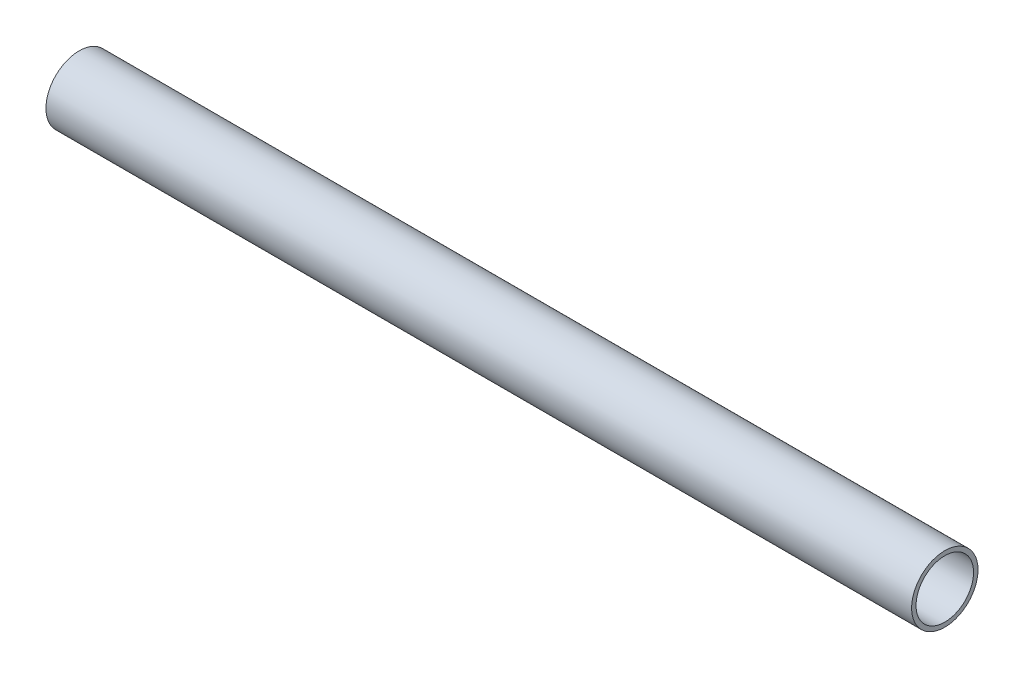
ISO-10303-21;
HEADER;
FILE_DESCRIPTION(('STEP AP214'),'2;1');
FILE_NAME('part.step','',(''),(''),'','','');
FILE_SCHEMA(('AUTOMOTIVE_DESIGN { 1 0 10303 214 1 1 1 1 }'));
ENDSEC;
DATA;
#1=APPLICATION_CONTEXT('core data for automotive mechanical design processes');
#2=APPLICATION_PROTOCOL_DEFINITION('international standard','automotive_design',2000,#1);
#3=PRODUCT_CONTEXT('',#1,'mechanical');
#4=PRODUCT('Part','Part','',(#3));
#5=PRODUCT_RELATED_PRODUCT_CATEGORY('part','',(#4));
#6=PRODUCT_DEFINITION_FORMATION('','',#4);
#7=PRODUCT_DEFINITION_CONTEXT('part definition',#1,'design');
#8=PRODUCT_DEFINITION('design','',#6,#7);
#9=PRODUCT_DEFINITION_SHAPE('','',#8);
#10=(LENGTH_UNIT() NAMED_UNIT(*) SI_UNIT(.MILLI.,.METRE.));
#11=(NAMED_UNIT(*) PLANE_ANGLE_UNIT() SI_UNIT($,.RADIAN.));
#12=(NAMED_UNIT(*) SI_UNIT($,.STERADIAN.) SOLID_ANGLE_UNIT());
#13=UNCERTAINTY_MEASURE_WITH_UNIT(LENGTH_MEASURE(1.E-05),#10,'distance_accuracy_value','');
#14=(GEOMETRIC_REPRESENTATION_CONTEXT(3) GLOBAL_UNCERTAINTY_ASSIGNED_CONTEXT((#13)) GLOBAL_UNIT_ASSIGNED_CONTEXT((#10,
#11,#12)) REPRESENTATION_CONTEXT('',''));
#15=CARTESIAN_POINT('',(0.,0.,0.));
#16=DIRECTION('',(0.,0.,1.));
#17=DIRECTION('',(1.,0.,0.));
#18=AXIS2_PLACEMENT_3D('',#15,#16,#17);
#19=CARTESIAN_POINT('',(195.58,0.,0.));
#20=DIRECTION('',(1.,0.,0.));
#21=DIRECTION('',(0.,0.,-1.));
#22=AXIS2_PLACEMENT_3D('',#19,#20,#21);
#23=PLANE('',#22);
#24=CARTESIAN_POINT('',(195.58,0.,0.));
#25=DIRECTION('',(1.,0.,0.));
#26=DIRECTION('',(0.,0.,-1.));
#27=AXIS2_PLACEMENT_3D('',#24,#25,#26);
#28=CIRCLE('',#27,7.5);
#29=CARTESIAN_POINT('',(195.58,0.,-7.5));
#30=VERTEX_POINT('',#29);
#31=EDGE_CURVE('E12',#30,#30,#28,.T.);
#32=ORIENTED_EDGE('',*,*,#31,.T.);
#33=EDGE_LOOP('',(#32));
#34=FACE_BOUND('',#33,.T.);
#35=CARTESIAN_POINT('',(195.58,0.,0.));
#36=DIRECTION('',(1.,0.,0.));
#37=DIRECTION('',(0.,0.,-1.));
#38=AXIS2_PLACEMENT_3D('',#35,#36,#37);
#39=CIRCLE('',#38,6.5);
#40=CARTESIAN_POINT('',(195.58,0.,-6.5));
#41=VERTEX_POINT('',#40);
#42=EDGE_CURVE('E54',#41,#41,#39,.T.);
#43=ORIENTED_EDGE('',*,*,#42,.F.);
#44=EDGE_LOOP('',(#43));
#45=FACE_BOUND('',#44,.T.);
#46=ADVANCED_FACE('F43',(#34,#45),#23,.T.);
#47=CARTESIAN_POINT('',(0.,0.,0.));
#48=DIRECTION('',(1.,0.,0.));
#49=DIRECTION('',(0.,0.,-1.));
#50=AXIS2_PLACEMENT_3D('',#47,#48,#49);
#51=PLANE('',#50);
#52=CARTESIAN_POINT('',(0.,0.,0.));
#53=DIRECTION('',(1.,0.,0.));
#54=DIRECTION('',(0.,0.,-1.));
#55=AXIS2_PLACEMENT_3D('',#52,#53,#54);
#56=CIRCLE('',#55,7.5);
#57=CARTESIAN_POINT('',(0.,0.,-7.5));
#58=VERTEX_POINT('',#57);
#59=EDGE_CURVE('E47',#58,#58,#56,.T.);
#60=ORIENTED_EDGE('',*,*,#59,.F.);
#61=EDGE_LOOP('',(#60));
#62=FACE_BOUND('',#61,.T.);
#63=CARTESIAN_POINT('',(0.,0.,0.));
#64=DIRECTION('',(1.,0.,0.));
#65=DIRECTION('',(0.,0.,-1.));
#66=AXIS2_PLACEMENT_3D('',#63,#64,#65);
#67=CIRCLE('',#66,6.5);
#68=CARTESIAN_POINT('',(0.,0.,-6.5));
#69=VERTEX_POINT('',#68);
#70=EDGE_CURVE('E56',#69,#69,#67,.T.);
#71=ORIENTED_EDGE('',*,*,#70,.T.);
#72=EDGE_LOOP('',(#71));
#73=FACE_BOUND('',#72,.T.);
#74=ADVANCED_FACE('F66',(#62,#73),#51,.F.);
#75=CARTESIAN_POINT('',(195.58,0.,0.));
#76=DIRECTION('',(-1.,0.,0.));
#77=DIRECTION('',(0.,0.,1.));
#78=AXIS2_PLACEMENT_3D('',#75,#76,#77);
#79=CYLINDRICAL_SURFACE('',#78,7.5);
#80=ORIENTED_EDGE('',*,*,#31,.F.);
#81=EDGE_LOOP('',(#80));
#82=FACE_BOUND('',#81,.T.);
#83=ORIENTED_EDGE('',*,*,#59,.T.);
#84=EDGE_LOOP('',(#83));
#85=FACE_BOUND('',#84,.T.);
#86=ADVANCED_FACE('F45',(#82,#85),#79,.T.);
#87=CARTESIAN_POINT('',(195.58,0.,0.));
#88=DIRECTION('',(-1.,0.,0.));
#89=DIRECTION('',(0.,0.,1.));
#90=AXIS2_PLACEMENT_3D('',#87,#88,#89);
#91=CYLINDRICAL_SURFACE('',#90,6.5);
#92=ORIENTED_EDGE('',*,*,#42,.T.);
#93=EDGE_LOOP('',(#92));
#94=FACE_BOUND('',#93,.T.);
#95=ORIENTED_EDGE('',*,*,#70,.F.);
#96=EDGE_LOOP('',(#95));
#97=FACE_BOUND('',#96,.T.);
#98=ADVANCED_FACE('F62',(#94,#97),#91,.F.);
#99=CLOSED_SHELL('',(#46,#74,#86,#98));
#100=MANIFOLD_SOLID_BREP('B2',#99);
#101=ADVANCED_BREP_SHAPE_REPRESENTATION('',(#18,#100),#14);
#102=SHAPE_DEFINITION_REPRESENTATION(#9,#101);
ENDSEC;
END-ISO-10303-21;
